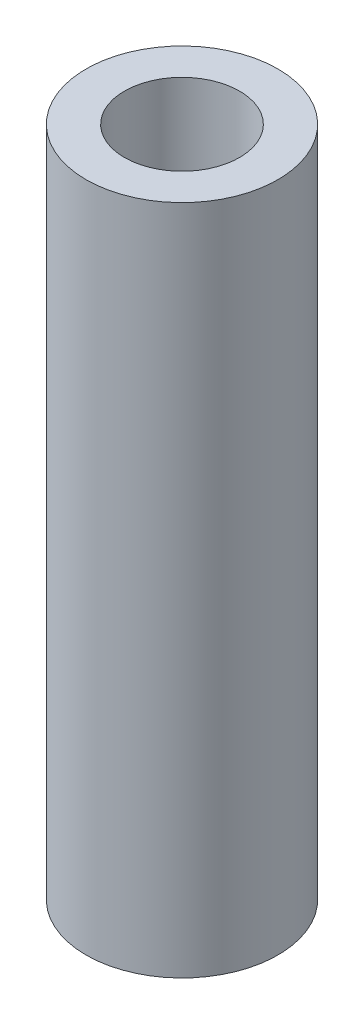
ISO-10303-21;
HEADER;
FILE_DESCRIPTION(('STEP AP214'),'2;1');
FILE_NAME('part.step','',(''),(''),'','','');
FILE_SCHEMA(('AUTOMOTIVE_DESIGN { 1 0 10303 214 1 1 1 1 }'));
ENDSEC;
DATA;
#1=APPLICATION_CONTEXT('core data for automotive mechanical design processes');
#2=APPLICATION_PROTOCOL_DEFINITION('international standard','automotive_design',2000,#1);
#3=PRODUCT_CONTEXT('',#1,'mechanical');
#4=PRODUCT('Part','Part','',(#3));
#5=PRODUCT_RELATED_PRODUCT_CATEGORY('part','',(#4));
#6=PRODUCT_DEFINITION_FORMATION('','',#4);
#7=PRODUCT_DEFINITION_CONTEXT('part definition',#1,'design');
#8=PRODUCT_DEFINITION('design','',#6,#7);
#9=PRODUCT_DEFINITION_SHAPE('','',#8);
#10=(LENGTH_UNIT() NAMED_UNIT(*) SI_UNIT(.MILLI.,.METRE.));
#11=(NAMED_UNIT(*) PLANE_ANGLE_UNIT() SI_UNIT($,.RADIAN.));
#12=(NAMED_UNIT(*) SI_UNIT($,.STERADIAN.) SOLID_ANGLE_UNIT());
#13=UNCERTAINTY_MEASURE_WITH_UNIT(LENGTH_MEASURE(1.E-05),#10,'distance_accuracy_value','');
#14=(GEOMETRIC_REPRESENTATION_CONTEXT(3) GLOBAL_UNCERTAINTY_ASSIGNED_CONTEXT((#13)) GLOBAL_UNIT_ASSIGNED_CONTEXT((#10,
#11,#12)) REPRESENTATION_CONTEXT('',''));
#15=CARTESIAN_POINT('',(0.,0.,0.));
#16=DIRECTION('',(0.,0.,1.));
#17=DIRECTION('',(1.,0.,0.));
#18=AXIS2_PLACEMENT_3D('',#15,#16,#17);
#19=CARTESIAN_POINT('',(0.,35.,0.));
#20=DIRECTION('',(0.,1.,0.));
#21=DIRECTION('',(0.,0.,1.));
#22=AXIS2_PLACEMENT_3D('',#19,#20,#21);
#23=PLANE('',#22);
#24=CARTESIAN_POINT('',(0.,35.,0.));
#25=DIRECTION('',(0.,1.,0.));
#26=DIRECTION('',(0.,0.,1.));
#27=AXIS2_PLACEMENT_3D('',#24,#25,#26);
#28=CIRCLE('',#27,5.);
#29=CARTESIAN_POINT('',(0.,35.,5.));
#30=VERTEX_POINT('',#29);
#31=EDGE_CURVE('E10',#30,#30,#28,.T.);
#32=ORIENTED_EDGE('',*,*,#31,.T.);
#33=EDGE_LOOP('',(#32));
#34=FACE_BOUND('',#33,.T.);
#35=CARTESIAN_POINT('',(0.,35.,0.));
#36=DIRECTION('',(0.,1.,0.));
#37=DIRECTION('',(0.,0.,1.));
#38=AXIS2_PLACEMENT_3D('',#35,#36,#37);
#39=CIRCLE('',#38,3.);
#40=CARTESIAN_POINT('',(0.,35.,3.));
#41=VERTEX_POINT('',#40);
#42=EDGE_CURVE('E50',#41,#41,#39,.T.);
#43=ORIENTED_EDGE('',*,*,#42,.F.);
#44=EDGE_LOOP('',(#43));
#45=FACE_BOUND('',#44,.T.);
#46=ADVANCED_FACE('F37',(#34,#45),#23,.T.);
#47=CARTESIAN_POINT('',(0.,0.,0.));
#48=DIRECTION('',(0.,1.,0.));
#49=DIRECTION('',(0.,0.,1.));
#50=AXIS2_PLACEMENT_3D('',#47,#48,#49);
#51=PLANE('',#50);
#52=CARTESIAN_POINT('',(0.,0.,0.));
#53=DIRECTION('',(0.,1.,0.));
#54=DIRECTION('',(0.,0.,1.));
#55=AXIS2_PLACEMENT_3D('',#52,#53,#54);
#56=CIRCLE('',#55,5.);
#57=CARTESIAN_POINT('',(0.,0.,5.));
#58=VERTEX_POINT('',#57);
#59=EDGE_CURVE('E41',#58,#58,#56,.T.);
#60=ORIENTED_EDGE('',*,*,#59,.F.);
#61=EDGE_LOOP('',(#60));
#62=FACE_BOUND('',#61,.T.);
#63=CARTESIAN_POINT('',(0.,0.,0.));
#64=DIRECTION('',(0.,1.,0.));
#65=DIRECTION('',(0.,0.,1.));
#66=AXIS2_PLACEMENT_3D('',#63,#64,#65);
#67=CIRCLE('',#66,3.);
#68=CARTESIAN_POINT('',(0.,0.,3.));
#69=VERTEX_POINT('',#68);
#70=EDGE_CURVE('E52',#69,#69,#67,.T.);
#71=ORIENTED_EDGE('',*,*,#70,.T.);
#72=EDGE_LOOP('',(#71));
#73=FACE_BOUND('',#72,.T.);
#74=ADVANCED_FACE('F64',(#62,#73),#51,.F.);
#75=CARTESIAN_POINT('',(0.,35.,0.));
#76=DIRECTION('',(0.,-1.,0.));
#77=DIRECTION('',(0.,0.,-1.));
#78=AXIS2_PLACEMENT_3D('',#75,#76,#77);
#79=CYLINDRICAL_SURFACE('',#78,5.);
#80=ORIENTED_EDGE('',*,*,#31,.F.);
#81=EDGE_LOOP('',(#80));
#82=FACE_BOUND('',#81,.T.);
#83=ORIENTED_EDGE('',*,*,#59,.T.);
#84=EDGE_LOOP('',(#83));
#85=FACE_BOUND('',#84,.T.);
#86=ADVANCED_FACE('F39',(#82,#85),#79,.T.);
#87=CARTESIAN_POINT('',(0.,35.,0.));
#88=DIRECTION('',(0.,-1.,0.));
#89=DIRECTION('',(0.,0.,-1.));
#90=AXIS2_PLACEMENT_3D('',#87,#88,#89);
#91=CYLINDRICAL_SURFACE('',#90,3.);
#92=ORIENTED_EDGE('',*,*,#42,.T.);
#93=EDGE_LOOP('',(#92));
#94=FACE_BOUND('',#93,.T.);
#95=ORIENTED_EDGE('',*,*,#70,.F.);
#96=EDGE_LOOP('',(#95));
#97=FACE_BOUND('',#96,.T.);
#98=ADVANCED_FACE('F60',(#94,#97),#91,.F.);
#99=CLOSED_SHELL('',(#46,#74,#86,#98));
#100=MANIFOLD_SOLID_BREP('B2',#99);
#101=ADVANCED_BREP_SHAPE_REPRESENTATION('',(#18,#100),#14);
#102=SHAPE_DEFINITION_REPRESENTATION(#9,#101);
ENDSEC;
END-ISO-10303-21;
